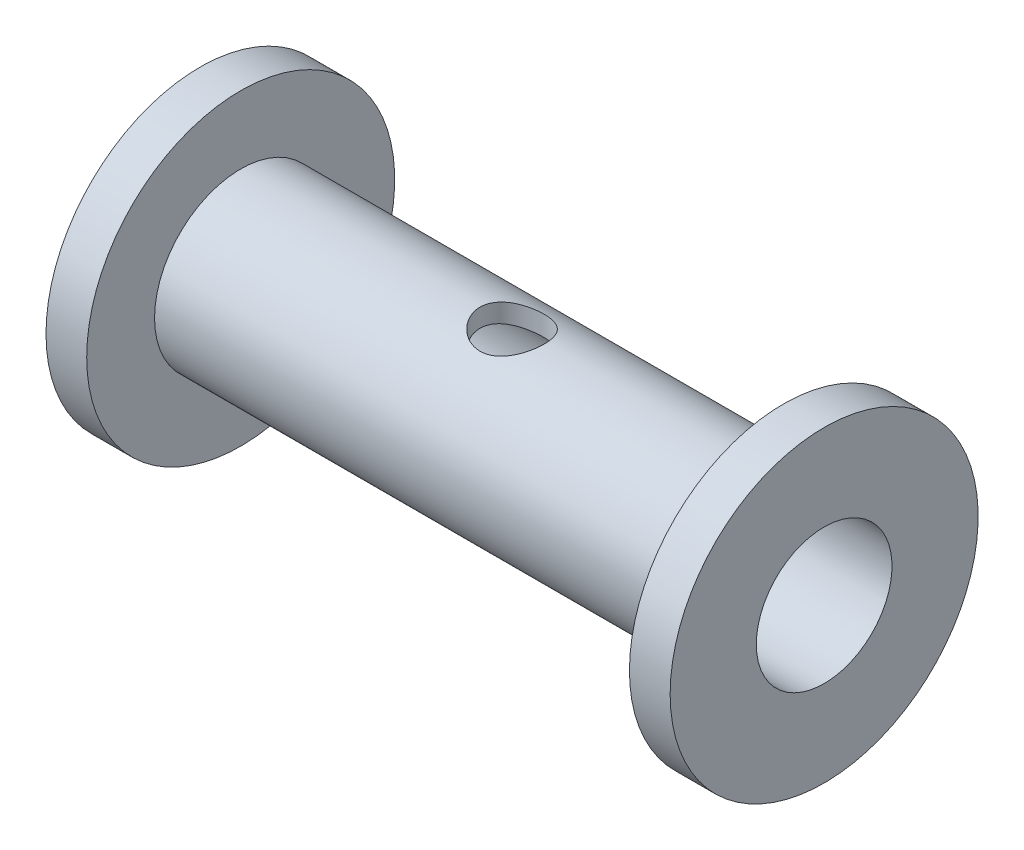
ISO-10303-21;
HEADER;
FILE_DESCRIPTION(('STEP AP214'),'2;1');
FILE_NAME('part.step','',(''),(''),'','','');
FILE_SCHEMA(('AUTOMOTIVE_DESIGN { 1 0 10303 214 1 1 1 1 }'));
ENDSEC;
DATA;
#1=APPLICATION_CONTEXT('core data for automotive mechanical design processes');
#2=APPLICATION_PROTOCOL_DEFINITION('international standard','automotive_design',2000,#1);
#3=PRODUCT_CONTEXT('',#1,'mechanical');
#4=PRODUCT('Part','Part','',(#3));
#5=PRODUCT_RELATED_PRODUCT_CATEGORY('part','',(#4));
#6=PRODUCT_DEFINITION_FORMATION('','',#4);
#7=PRODUCT_DEFINITION_CONTEXT('part definition',#1,'design');
#8=PRODUCT_DEFINITION('design','',#6,#7);
#9=PRODUCT_DEFINITION_SHAPE('','',#8);
#10=(LENGTH_UNIT() NAMED_UNIT(*) SI_UNIT(.MILLI.,.METRE.));
#11=(NAMED_UNIT(*) PLANE_ANGLE_UNIT() SI_UNIT($,.RADIAN.));
#12=(NAMED_UNIT(*) SI_UNIT($,.STERADIAN.) SOLID_ANGLE_UNIT());
#13=UNCERTAINTY_MEASURE_WITH_UNIT(LENGTH_MEASURE(1.E-05),#10,'distance_accuracy_value','');
#14=(GEOMETRIC_REPRESENTATION_CONTEXT(3) GLOBAL_UNCERTAINTY_ASSIGNED_CONTEXT((#13)) GLOBAL_UNIT_ASSIGNED_CONTEXT((#10,
#11,#12)) REPRESENTATION_CONTEXT('',''));
#15=CARTESIAN_POINT('',(0.,0.,0.));
#16=DIRECTION('',(0.,0.,1.));
#17=DIRECTION('',(1.,0.,0.));
#18=AXIS2_PLACEMENT_3D('',#15,#16,#17);
#19=CARTESIAN_POINT('',(-15.2755244755245,0.,0.));
#20=DIRECTION('',(-1.,0.,0.));
#21=DIRECTION('',(0.,0.,1.));
#22=AXIS2_PLACEMENT_3D('',#19,#20,#21);
#23=CYLINDRICAL_SURFACE('',#22,3.175);
#24=CARTESIAN_POINT('',(14.605,0.,0.));
#25=DIRECTION('',(-1.,0.,0.));
#26=DIRECTION('',(0.,0.,1.));
#27=AXIS2_PLACEMENT_3D('',#24,#25,#26);
#28=CIRCLE('',#27,3.175);
#29=CARTESIAN_POINT('',(14.605,0.,3.175));
#30=VERTEX_POINT('',#29);
#31=EDGE_CURVE('E80',#30,#30,#28,.T.);
#32=ORIENTED_EDGE('',*,*,#31,.F.);
#33=EDGE_LOOP('',(#32));
#34=FACE_BOUND('',#33,.T.);
#35=CARTESIAN_POINT('',(-14.605,0.,0.));
#36=DIRECTION('',(-1.,0.,0.));
#37=DIRECTION('',(0.,0.,1.));
#38=AXIS2_PLACEMENT_3D('',#35,#36,#37);
#39=CIRCLE('',#38,3.175);
#40=CARTESIAN_POINT('',(-14.605,0.,3.175));
#41=VERTEX_POINT('',#40);
#42=EDGE_CURVE('E74',#41,#41,#39,.T.);
#43=ORIENTED_EDGE('',*,*,#42,.T.);
#44=EDGE_LOOP('',(#43));
#45=FACE_BOUND('',#44,.T.);
#46=CARTESIAN_POINT('',(0.,2.7983253920872,-1.5));
#47=CARTESIAN_POINT('',(0.0788107476010317,2.79833097649977,-1.49999523547047));
#48=CARTESIAN_POINT('',(0.157735612205732,2.80170427159323,-1.49374832449328));
#49=CARTESIAN_POINT('',(0.313214667514685,2.81472644561665,-1.4690554061353));
#50=CARTESIAN_POINT('',(0.389762907162894,2.82438992585351,-1.45058101361493));
#51=CARTESIAN_POINT('',(0.537952673756733,2.84863009396432,-1.40237253355636));
#52=CARTESIAN_POINT('',(0.609616136431819,2.86318279906116,-1.37269332197988));
#53=CARTESIAN_POINT('',(0.74692939284759,2.89552502377023,-1.30308399064543));
#54=CARTESIAN_POINT('',(0.8125794422789,2.91331440566267,-1.26315430701281));
#55=CARTESIAN_POINT('',(0.941323245258398,2.95172227722859,-1.1707430871524));
#56=CARTESIAN_POINT('',(1.00387788849068,2.97245254188493,-1.11755658650795));
#57=CARTESIAN_POINT('',(1.11959143684936,3.01349951044786,-1.00161259672222));
#58=CARTESIAN_POINT('',(1.17274606260041,3.03381602228766,-0.938850772491945));
#59=CARTESIAN_POINT('',(1.27118937954777,3.07317288716969,-0.801034900704515));
#60=CARTESIAN_POINT('',(1.31583450125175,3.09206866660246,-0.725476017233364));
#61=CARTESIAN_POINT('',(1.39153752206176,3.12503381595021,-0.566861686619154));
#62=CARTESIAN_POINT('',(1.42260309774527,3.13910591174128,-0.483810507023549));
#63=CARTESIAN_POINT('',(1.46819431985617,3.16003750546179,-0.318263833167133));
#64=CARTESIAN_POINT('',(1.4836598006004,3.16730464125021,-0.23607983759682));
#65=CARTESIAN_POINT('',(1.50068669846295,3.17531500926786,-0.0699854874354078));
#66=CARTESIAN_POINT('',(1.50225551712034,3.17606171435844,0.0139239243031286));
#67=CARTESIAN_POINT('',(1.49185310738046,3.1711569999128,0.17410404695592));
#68=CARTESIAN_POINT('',(1.4809263684281,3.16599910390162,0.250460926307549));
#69=CARTESIAN_POINT('',(1.44768451199486,3.15058713309443,0.400106757592313));
#70=CARTESIAN_POINT('',(1.42536854800002,3.14033267949386,0.473395481043944));
#71=CARTESIAN_POINT('',(1.36978180811971,3.11549383971164,0.61616215999247));
#72=CARTESIAN_POINT('',(1.33635400002596,3.10084769916082,0.685567785451937));
#73=CARTESIAN_POINT('',(1.25968096352203,3.06858481389696,0.817962218284119));
#74=CARTESIAN_POINT('',(1.21643213988174,3.05096698193041,0.880948663490016));
#75=CARTESIAN_POINT('',(1.11701776567009,3.01265189942243,1.00453666893054));
#76=CARTESIAN_POINT('',(1.06005736803148,2.9918200943109,1.0644578414785));
#77=CARTESIAN_POINT('',(0.93699705964444,2.95046283361779,1.17424124933889));
#78=CARTESIAN_POINT('',(0.87089145595116,2.92993757775203,1.2240971710571));
#79=CARTESIAN_POINT('',(0.727172138151077,2.89039711066438,1.31484174230845));
#80=CARTESIAN_POINT('',(0.649138941996297,2.87151577260243,1.35512986365461));
#81=CARTESIAN_POINT('',(0.486283743531031,2.83914834140001,1.42170562946273));
#82=CARTESIAN_POINT('',(0.401468219875632,2.82565717160027,1.44800645544408));
#83=CARTESIAN_POINT('',(0.234253704737598,2.80697974613979,1.48387059914899));
#84=CARTESIAN_POINT('',(0.152157558069844,2.80124227464673,1.4945499135996));
#85=CARTESIAN_POINT('',(-0.0128364544628812,2.79714234532468,1.50221328025957));
#86=CARTESIAN_POINT('',(-0.0957338532268694,2.79877582206013,1.49920488189903));
#87=CARTESIAN_POINT('',(-0.25184110118071,2.80865284380239,1.4806017347564));
#88=CARTESIAN_POINT('',(-0.32523813353968,2.81627144126264,1.46619608896935));
#89=CARTESIAN_POINT('',(-0.468463633051388,2.83637948512089,1.42690562153975));
#90=CARTESIAN_POINT('',(-0.538291075738513,2.8488703210638,1.40201781025962));
#91=CARTESIAN_POINT('',(-0.676035807524976,2.87800314814948,1.3412324594274));
#92=CARTESIAN_POINT('',(-0.743715994140066,2.89481019393091,1.30487958898417));
#93=CARTESIAN_POINT('',(-0.872389828600745,2.93050507850425,1.22260967416881));
#94=CARTESIAN_POINT('',(-0.93338011780599,2.94939395301752,1.17668785898318));
#95=CARTESIAN_POINT('',(-1.05395122429284,2.98962533435876,1.07066250220429));
#96=CARTESIAN_POINT('',(-1.11263900919066,3.0110091844446,1.00955462247668));
#97=CARTESIAN_POINT('',(-1.2191662131219,3.05197816465585,0.877952835832725));
#98=CARTESIAN_POINT('',(-1.26700313884629,3.07156288076261,0.807456777596013));
#99=CARTESIAN_POINT('',(-1.35106340432696,3.10717258491727,0.657374049291596));
#100=CARTESIAN_POINT('',(-1.38708244177874,3.12313361565429,0.577656753882327));
#101=CARTESIAN_POINT('',(-1.44486593502356,3.14922093597641,0.412327293299583));
#102=CARTESIAN_POINT('',(-1.46664154231209,3.15935178938716,0.326719797872878));
#103=CARTESIAN_POINT('',(-1.49363889435459,3.17197971044583,0.159896332874223));
#104=CARTESIAN_POINT('',(-1.50011013632642,3.17505233840112,0.078925398284078));
#105=CARTESIAN_POINT('',(-1.49988711965684,3.17494636529876,-0.0829833461657175));
#106=CARTESIAN_POINT('',(-1.49319653511093,3.17176950877122,-0.163921158963004));
#107=CARTESIAN_POINT('',(-1.46770848023088,3.15985410378094,-0.318841842835547));
#108=CARTESIAN_POINT('',(-1.44959197491994,3.15142868675494,-0.392963167600614));
#109=CARTESIAN_POINT('',(-1.40262108547478,3.13010132928976,-0.537026434022491));
#110=CARTESIAN_POINT('',(-1.37376499240882,3.1171986764347,-0.60696770847403));
#111=CARTESIAN_POINT('',(-1.30473490189286,3.08738510301285,-0.744198443618439));
#112=CARTESIAN_POINT('',(-1.26410939390821,3.0703197298679,-0.811226286131094));
#113=CARTESIAN_POINT('',(-1.17328432091972,3.03405477724481,-0.937805412907553));
#114=CARTESIAN_POINT('',(-1.12308040855481,3.01485423033003,-0.997353281796323));
#115=CARTESIAN_POINT('',(-1.00928446778082,2.97425749382228,-1.11287613406119));
#116=CARTESIAN_POINT('',(-0.944896373173603,2.9528185885393,-1.16805442942683));
#117=CARTESIAN_POINT('',(-0.807312145748489,2.91171333700677,-1.26705651381277));
#118=CARTESIAN_POINT('',(-0.734109598744511,2.89204830000693,-1.31087196019013));
#119=CARTESIAN_POINT('',(-0.579232422210802,2.85663554941127,-1.3863737982034));
#120=CARTESIAN_POINT('',(-0.497439352525226,2.84095675906997,-1.41785130272302));
#121=CARTESIAN_POINT('',(-0.328811998329219,2.81635628214136,-1.4661232120466));
#122=CARTESIAN_POINT('',(-0.241995696672077,2.80741192483264,-1.48296690968124));
#123=CARTESIAN_POINT('',(-0.128694633247988,2.80116429672363,-1.49469268672873));
#124=CARTESIAN_POINT('',(-0.10301180774758,2.80010260103933,-1.49668048940514));
#125=CARTESIAN_POINT('',(-0.0515567295081782,2.79868221732461,-1.49933495903092));
#126=CARTESIAN_POINT('',(-0.0257844722890938,2.79832356503778,-1.50000155880871));
#127=CARTESIAN_POINT('',(0.,2.7983253920872,-1.5));
#128=B_SPLINE_CURVE_WITH_KNOTS('',3,(#46,#47,#48,#49,#50,#51,#52,#53,#54,#55,#56,#57,#58,#59,
#60,#61,#62,#63,#64,#65,#66,#67,#68,#69,#70,#71,#72,#73,#74,#75,#76,#77,#78,#79,#80,#81,#82,#83,
#84,#85,#86,#87,#88,#89,#90,#91,#92,#93,#94,#95,#96,#97,#98,#99,#100,#101,#102,#103,#104,#105,
#106,#107,#108,#109,#110,#111,#112,#113,#114,#115,#116,#117,#118,#119,#120,#121,#122,#123,#124,
#125,#126,#127),.UNSPECIFIED.,.T.,.F.,(4,2,2,2,2,2,2,2,2,2,2,2,2,2,2,2,2,2,2,2,2,2,2,2,2,2,2,2,
2,2,2,2,2,2,2,2,2,2,2,2,4),(0.,0.236323871838544,0.473198284289302,0.708927337380699,
0.944646362603916,1.19762429635865,1.45071710395354,1.71864285343498,1.98641694681215,
2.23687152724756,2.48719270436037,2.71802817018661,2.94888079555674,3.1831453100556,
3.41749572162706,3.67216706074964,3.92699765369087,4.19506898546716,4.46288723920479,
4.71043828617548,4.95785281342715,5.18239796950746,5.40700721193729,5.64198832122139,
5.87708686716682,6.13804637958085,6.39906579463174,6.66438519401193,6.92949661955738,
7.17207877892644,7.41459323161728,7.64386670961211,7.87317668624822,8.11282240294707,
8.35257714778319,8.61378861881715,8.87519133270404,9.14084608292566,9.40560248746477,
9.48291651801969,9.56023447921351),.UNSPECIFIED.);
#129=CARTESIAN_POINT('',(0.,2.7983253920872,-1.5));
#130=VERTEX_POINT('',#129);
#131=EDGE_CURVE('E99',#130,#130,#128,.T.);
#132=ORIENTED_EDGE('',*,*,#131,.F.);
#133=EDGE_LOOP('',(#132));
#134=FACE_BOUND('',#133,.T.);
#135=ADVANCED_FACE('F53',(#34,#45,#134),#23,.F.);
#136=CARTESIAN_POINT('',(-15.2755244755245,0.,0.));
#137=DIRECTION('',(-1.,0.,0.));
#138=DIRECTION('',(0.,0.,1.));
#139=AXIS2_PLACEMENT_3D('',#136,#137,#138);
#140=CYLINDRICAL_SURFACE('',#139,4.03225);
#141=CARTESIAN_POINT('',(-12.7,0.,0.));
#142=DIRECTION('',(-1.,0.,0.));
#143=DIRECTION('',(0.,0.,1.));
#144=AXIS2_PLACEMENT_3D('',#141,#142,#143);
#145=CIRCLE('',#144,4.03225);
#146=CARTESIAN_POINT('',(-12.7,0.,4.03225));
#147=VERTEX_POINT('',#146);
#148=EDGE_CURVE('E96',#147,#147,#145,.T.);
#149=ORIENTED_EDGE('',*,*,#148,.F.);
#150=EDGE_LOOP('',(#149));
#151=FACE_BOUND('',#150,.T.);
#152=CARTESIAN_POINT('',(12.7,0.,0.));
#153=DIRECTION('',(-1.,0.,0.));
#154=DIRECTION('',(0.,0.,1.));
#155=AXIS2_PLACEMENT_3D('',#152,#153,#154);
#156=CIRCLE('',#155,4.03225);
#157=CARTESIAN_POINT('',(12.7,0.,4.03225));
#158=VERTEX_POINT('',#157);
#159=EDGE_CURVE('E92',#158,#158,#156,.T.);
#160=ORIENTED_EDGE('',*,*,#159,.T.);
#161=EDGE_LOOP('',(#160));
#162=FACE_BOUND('',#161,.T.);
#163=CARTESIAN_POINT('',(0.,3.74286522099046,-1.5));
#164=CARTESIAN_POINT('',(0.0810605082532311,3.74286262545742,-1.50000280860716));
#165=CARTESIAN_POINT('',(0.162102326967374,3.74552715792148,-1.49340731690282));
#166=CARTESIAN_POINT('',(0.321745734418679,3.75582400206754,-1.46731743450885));
#167=CARTESIAN_POINT('',(0.400347365104893,3.76345622830077,-1.44782326568791));
#168=CARTESIAN_POINT('',(0.552761522089942,3.78270682523499,-1.39674760930536));
#169=CARTESIAN_POINT('',(0.626584881752979,3.79431577447426,-1.36519467055229));
#170=CARTESIAN_POINT('',(0.767918696133514,3.82019671649696,-1.29099805093523));
#171=CARTESIAN_POINT('',(0.83542727939898,3.83446949500481,-1.24835109630931));
#172=CARTESIAN_POINT('',(0.965516163547924,3.86485187022262,-1.15094362675974));
#173=CARTESIAN_POINT('',(1.02774394846759,3.88101491695662,-1.09572887260401));
#174=CARTESIAN_POINT('',(1.14230456469602,3.91291033270932,-0.975717349532377));
#175=CARTESIAN_POINT('',(1.19463532821201,3.92864261114133,-0.910918583249523));
#176=CARTESIAN_POINT('',(1.28960700367383,3.9585379830802,-0.770910034768358));
#177=CARTESIAN_POINT('',(1.33186577238466,3.97263109085241,-0.695424754317507));
#178=CARTESIAN_POINT('',(1.40293902026793,3.99701868248392,-0.537799779474619));
#179=CARTESIAN_POINT('',(1.43175808219767,4.0073144609301,-0.455662364599041));
#180=CARTESIAN_POINT('',(1.47390058439084,4.0225679708103,-0.290770071921704));
#181=CARTESIAN_POINT('',(1.48783069408348,4.02773402720598,-0.208189890177394));
#182=CARTESIAN_POINT('',(1.50174259763788,4.03289304013209,-0.041713164447472));
#183=CARTESIAN_POINT('',(1.50172885505794,4.03288765209057,0.0421829496963453));
#184=CARTESIAN_POINT('',(1.48810912560577,4.02783755319846,0.204565721615127));
#185=CARTESIAN_POINT('',(1.47516507686668,4.0230382565197,0.283116851808199));
#186=CARTESIAN_POINT('',(1.43716422426303,4.00926043121792,0.436840120553872));
#187=CARTESIAN_POINT('',(1.41210656430194,4.00028160721984,0.512012019878063));
#188=CARTESIAN_POINT('',(1.35027656141209,3.97887378010392,0.658133625501671));
#189=CARTESIAN_POINT('',(1.31333993478245,3.96639672742092,0.729006486143544));
#190=CARTESIAN_POINT('',(1.22894508281966,3.93925779087783,0.863722898343242));
#191=CARTESIAN_POINT('',(1.18148349340397,3.92459520895176,0.927564192622355));
#192=CARTESIAN_POINT('',(1.07418544513035,3.89360117668711,1.05030799530885));
#193=CARTESIAN_POINT('',(1.01379320776523,3.87722224784568,1.10871341413277));
#194=CARTESIAN_POINT('',(0.883969759515727,3.84532037315715,1.21475290171194));
#195=CARTESIAN_POINT('',(0.814536358844123,3.82979763598216,1.26238435331695));
#196=CARTESIAN_POINT('',(0.666669776417092,3.80106928483374,1.34645283888991));
#197=CARTESIAN_POINT('',(0.58807496744726,3.78792077737118,1.38262667399653));
#198=CARTESIAN_POINT('',(0.425291566528801,3.7660895474432,1.44103907782427));
#199=CARTESIAN_POINT('',(0.341106055494909,3.75740438800916,1.46328525243885));
#200=CARTESIAN_POINT('',(0.174436686737479,3.74605633474948,1.49208917152611));
#201=CARTESIAN_POINT('',(0.0921097825418008,3.74309126805202,1.49943522240061));
#202=CARTESIAN_POINT('',(-0.0726357872383872,3.74266450431823,1.50050157116152));
#203=CARTESIAN_POINT('',(-0.155054425499946,3.74520146331211,1.49422519657268));
#204=CARTESIAN_POINT('',(-0.313636161157434,3.75518641964114,1.46893918100132));
#205=CARTESIAN_POINT('',(-0.389912048859508,3.76240099881889,1.45053409371867));
#206=CARTESIAN_POINT('',(-0.538259662800263,3.78065295701139,1.40227106523146));
#207=CARTESIAN_POINT('',(-0.610330532611422,3.79169111161244,1.37241080028978));
#208=CARTESIAN_POINT('',(-0.751194437864135,3.81685037763863,1.3008378099256));
#209=CARTESIAN_POINT('',(-0.819766741365623,3.83107065410563,1.25872654174382));
#210=CARTESIAN_POINT('',(-0.94915198555367,3.86082337186448,1.16427295076222));
#211=CARTESIAN_POINT('',(-1.00996211258778,3.87635628559249,1.11192693535525));
#212=CARTESIAN_POINT('',(-1.12601959259903,3.90815180773579,0.994635805675168));
#213=CARTESIAN_POINT('',(-1.18068563392994,3.92439970491397,0.92910952612849));
#214=CARTESIAN_POINT('',(-1.27831314836227,3.95486645770156,0.789414546656814));
#215=CARTESIAN_POINT('',(-1.32127462725588,3.96908531431507,0.715245851008674));
#216=CARTESIAN_POINT('',(-1.39397932428762,3.99387671518709,0.560448512840235));
#217=CARTESIAN_POINT('',(-1.42377184687962,4.00446282651824,0.4798453232322));
#218=CARTESIAN_POINT('',(-1.46921124897475,4.02084161942864,0.314288679595201));
#219=CARTESIAN_POINT('',(-1.48486465693151,4.02663651315213,0.229337252443971));
#220=CARTESIAN_POINT('',(-1.50088594823427,4.03257352309592,0.0627542440502475));
#221=CARTESIAN_POINT('',(-1.50208033338205,4.0330212699538,-0.0187876739602743));
#222=CARTESIAN_POINT('',(-1.49126909256499,4.0290070750733,-0.180860052366927));
#223=CARTESIAN_POINT('',(-1.47926501596501,4.02454570961462,-0.261390630361758));
#224=CARTESIAN_POINT('',(-1.4429761283355,4.01135207395564,-0.417218372620462));
#225=CARTESIAN_POINT('',(-1.41898911418693,4.00272353041785,-0.492594335669173));
#226=CARTESIAN_POINT('',(-1.3597100380317,3.98209514191057,-0.63825977639419));
#227=CARTESIAN_POINT('',(-1.32441583771856,3.97009465932517,-0.70854828889602));
#228=CARTESIAN_POINT('',(-1.24184728584167,3.94330311481887,-0.845254878885198));
#229=CARTESIAN_POINT('',(-1.1941345034695,3.92841650746543,-0.9113890861302));
#230=CARTESIAN_POINT('',(-1.08877832872892,3.89768413406652,-1.03496879561156));
#231=CARTESIAN_POINT('',(-1.03113141506256,3.88183802920943,-1.09241120330676));
#232=CARTESIAN_POINT('',(-0.903995918687687,3.84997088966022,-1.2000328015016));
#233=CARTESIAN_POINT('',(-0.834049003047494,3.83398321642173,-1.24968249159921));
#234=CARTESIAN_POINT('',(-0.686298727869584,3.80457800119995,-1.33653922685383));
#235=CARTESIAN_POINT('',(-0.608494793409266,3.79116064750339,-1.37374536061682));
#236=CARTESIAN_POINT('',(-0.444079552137688,3.76820874872597,-1.43554225419766));
#237=CARTESIAN_POINT('',(-0.357248878006704,3.75883624891752,-1.45961526901652));
#238=CARTESIAN_POINT('',(-0.180269683072115,3.74616784322325,-1.49183756142673));
#239=CARTESIAN_POINT('',(-0.0901232904178125,3.74286810671106,-1.49999687738303));
#240=CARTESIAN_POINT('',(0.,3.74286522099046,-1.5));
#241=B_SPLINE_CURVE_WITH_KNOTS('',3,(#163,#164,#165,#166,#167,#168,#169,#170,#171,#172,#173,
#174,#175,#176,#177,#178,#179,#180,#181,#182,#183,#184,#185,#186,#187,#188,#189,#190,#191,#192,
#193,#194,#195,#196,#197,#198,#199,#200,#201,#202,#203,#204,#205,#206,#207,#208,#209,#210,#211,
#212,#213,#214,#215,#216,#217,#218,#219,#220,#221,#222,#223,#224,#225,#226,#227,#228,#229,#230,
#231,#232,#233,#234,#235,#236,#237,#238,#239,#240),.UNSPECIFIED.,.T.,.F.,(4,2,2,2,2,2,2,2,2,2,2,
2,2,2,2,2,2,2,2,2,2,2,2,2,2,2,2,2,2,2,2,2,2,2,2,2,2,2,4),(0.,0.242846066218496,0.48568795537789,
0.727958449217654,0.97030051654549,1.22341624487427,1.47658479859802,1.73821156443558,
1.99974905375499,2.25016799334158,2.5005067714948,2.73865472806768,2.97681951756097,
3.21843095972489,3.46011973949005,3.71574562239636,3.97143353394805,4.23262841230694,
4.49368052747468,4.74051782572097,4.98729483626132,5.2226173653398,5.45798765597308,
5.70208814363682,5.94627686367409,6.20565491167122,6.46503283131093,6.7234312422891,
6.981710281885,7.22515095079881,7.46856304531068,7.70620625603547,7.94389443411667,
8.1915002919112,8.43919409843272,8.69970220653851,8.96022939066739,9.2303967750537,
9.5003936826016),.UNSPECIFIED.);
#242=CARTESIAN_POINT('',(0.,3.74286522099046,-1.5));
#243=VERTEX_POINT('',#242);
#244=EDGE_CURVE('E57',#243,#243,#241,.T.);
#245=ORIENTED_EDGE('',*,*,#244,.T.);
#246=EDGE_LOOP('',(#245));
#247=FACE_BOUND('',#246,.T.);
#248=ADVANCED_FACE('F113',(#151,#162,#247),#140,.T.);
#249=CARTESIAN_POINT('',(-12.7,0.,0.));
#250=DIRECTION('',(1.,0.,0.));
#251=DIRECTION('',(0.,0.,-1.));
#252=AXIS2_PLACEMENT_3D('',#249,#250,#251);
#253=PLANE('',#252);
#254=ORIENTED_EDGE('',*,*,#148,.T.);
#255=EDGE_LOOP('',(#254));
#256=FACE_BOUND('',#255,.T.);
#257=CARTESIAN_POINT('',(-12.7,0.,0.));
#258=DIRECTION('',(-1.,0.,0.));
#259=DIRECTION('',(0.,0.,1.));
#260=AXIS2_PLACEMENT_3D('',#257,#258,#259);
#261=CIRCLE('',#260,7.20725);
#262=CARTESIAN_POINT('',(-12.7,0.,7.20725));
#263=VERTEX_POINT('',#262);
#264=EDGE_CURVE('E10',#263,#263,#261,.T.);
#265=ORIENTED_EDGE('',*,*,#264,.F.);
#266=EDGE_LOOP('',(#265));
#267=FACE_BOUND('',#266,.T.);
#268=ADVANCED_FACE('F55',(#256,#267),#253,.T.);
#269=CARTESIAN_POINT('',(-15.2755244755245,0.,0.));
#270=DIRECTION('',(-1.,0.,0.));
#271=DIRECTION('',(0.,0.,1.));
#272=AXIS2_PLACEMENT_3D('',#269,#270,#271);
#273=CYLINDRICAL_SURFACE('',#272,7.20725);
#274=ORIENTED_EDGE('',*,*,#264,.T.);
#275=EDGE_LOOP('',(#274));
#276=FACE_BOUND('',#275,.T.);
#277=CARTESIAN_POINT('',(-14.605,0.,0.));
#278=DIRECTION('',(-1.,0.,0.));
#279=DIRECTION('',(0.,0.,1.));
#280=AXIS2_PLACEMENT_3D('',#277,#278,#279);
#281=CIRCLE('',#280,7.20725);
#282=CARTESIAN_POINT('',(-14.605,0.,7.20725));
#283=VERTEX_POINT('',#282);
#284=EDGE_CURVE('E67',#283,#283,#281,.T.);
#285=ORIENTED_EDGE('',*,*,#284,.F.);
#286=EDGE_LOOP('',(#285));
#287=FACE_BOUND('',#286,.T.);
#288=ADVANCED_FACE('F132',(#276,#287),#273,.T.);
#289=CARTESIAN_POINT('',(-14.605,0.,0.));
#290=DIRECTION('',(1.,0.,0.));
#291=DIRECTION('',(0.,0.,-1.));
#292=AXIS2_PLACEMENT_3D('',#289,#290,#291);
#293=PLANE('',#292);
#294=ORIENTED_EDGE('',*,*,#42,.F.);
#295=EDGE_LOOP('',(#294));
#296=FACE_BOUND('',#295,.T.);
#297=ORIENTED_EDGE('',*,*,#284,.T.);
#298=EDGE_LOOP('',(#297));
#299=FACE_BOUND('',#298,.T.);
#300=ADVANCED_FACE('F127',(#296,#299),#293,.F.);
#301=CARTESIAN_POINT('',(14.605,0.,0.));
#302=DIRECTION('',(1.,0.,0.));
#303=DIRECTION('',(0.,0.,-1.));
#304=AXIS2_PLACEMENT_3D('',#301,#302,#303);
#305=PLANE('',#304);
#306=ORIENTED_EDGE('',*,*,#31,.T.);
#307=EDGE_LOOP('',(#306));
#308=FACE_BOUND('',#307,.T.);
#309=CARTESIAN_POINT('',(14.605,0.,0.));
#310=DIRECTION('',(-1.,0.,0.));
#311=DIRECTION('',(0.,0.,1.));
#312=AXIS2_PLACEMENT_3D('',#309,#310,#311);
#313=CIRCLE('',#312,7.20725);
#314=CARTESIAN_POINT('',(14.605,0.,7.20725));
#315=VERTEX_POINT('',#314);
#316=EDGE_CURVE('E84',#315,#315,#313,.T.);
#317=ORIENTED_EDGE('',*,*,#316,.F.);
#318=EDGE_LOOP('',(#317));
#319=FACE_BOUND('',#318,.T.);
#320=ADVANCED_FACE('F124',(#308,#319),#305,.T.);
#321=CARTESIAN_POINT('',(-15.2755244755245,0.,0.));
#322=DIRECTION('',(-1.,0.,0.));
#323=DIRECTION('',(0.,0.,1.));
#324=AXIS2_PLACEMENT_3D('',#321,#322,#323);
#325=CYLINDRICAL_SURFACE('',#324,7.20725);
#326=CARTESIAN_POINT('',(12.7,0.,0.));
#327=DIRECTION('',(-1.,0.,0.));
#328=DIRECTION('',(0.,0.,1.));
#329=AXIS2_PLACEMENT_3D('',#326,#327,#328);
#330=CIRCLE('',#329,7.20725);
#331=CARTESIAN_POINT('',(12.7,0.,7.20725));
#332=VERTEX_POINT('',#331);
#333=EDGE_CURVE('E88',#332,#332,#330,.T.);
#334=ORIENTED_EDGE('',*,*,#333,.F.);
#335=EDGE_LOOP('',(#334));
#336=FACE_BOUND('',#335,.T.);
#337=ORIENTED_EDGE('',*,*,#316,.T.);
#338=EDGE_LOOP('',(#337));
#339=FACE_BOUND('',#338,.T.);
#340=ADVANCED_FACE('F121',(#336,#339),#325,.T.);
#341=CARTESIAN_POINT('',(12.7,0.,0.));
#342=DIRECTION('',(1.,0.,0.));
#343=DIRECTION('',(0.,0.,-1.));
#344=AXIS2_PLACEMENT_3D('',#341,#342,#343);
#345=PLANE('',#344);
#346=ORIENTED_EDGE('',*,*,#159,.F.);
#347=EDGE_LOOP('',(#346));
#348=FACE_BOUND('',#347,.T.);
#349=ORIENTED_EDGE('',*,*,#333,.T.);
#350=EDGE_LOOP('',(#349));
#351=FACE_BOUND('',#350,.T.);
#352=ADVANCED_FACE('F111',(#348,#351),#345,.F.);
#353=CARTESIAN_POINT('',(0.,7.20725,0.));
#354=DIRECTION('',(0.,-1.,0.));
#355=DIRECTION('',(0.,0.,-1.));
#356=AXIS2_PLACEMENT_3D('',#353,#354,#355);
#357=CYLINDRICAL_SURFACE('',#356,1.5);
#358=ORIENTED_EDGE('',*,*,#244,.F.);
#359=EDGE_LOOP('',(#358));
#360=FACE_BOUND('',#359,.T.);
#361=ORIENTED_EDGE('',*,*,#131,.T.);
#362=EDGE_LOOP('',(#361));
#363=FACE_BOUND('',#362,.T.);
#364=ADVANCED_FACE('F108',(#360,#363),#357,.F.);
#365=CLOSED_SHELL('',(#135,#248,#268,#288,#300,#320,#340,#352,#364));
#366=MANIFOLD_SOLID_BREP('B2',#365);
#367=ADVANCED_BREP_SHAPE_REPRESENTATION('',(#18,#366),#14);
#368=SHAPE_DEFINITION_REPRESENTATION(#9,#367);
ENDSEC;
END-ISO-10303-21;
